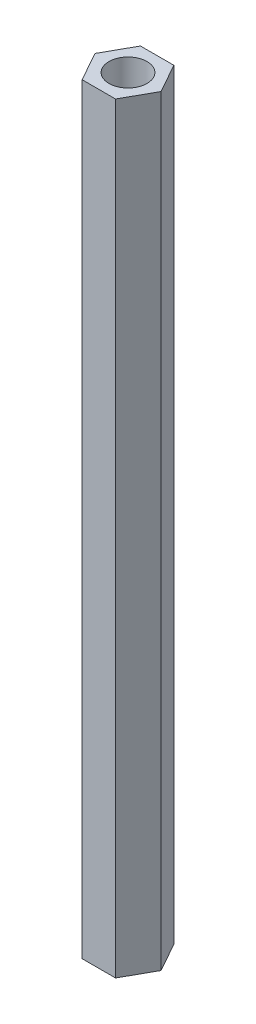
ISO-10303-21;
HEADER;
FILE_DESCRIPTION(('STEP AP214'),'2;1');
FILE_NAME('part.step','',(''),(''),'','','');
FILE_SCHEMA(('AUTOMOTIVE_DESIGN { 1 0 10303 214 1 1 1 1 }'));
ENDSEC;
DATA;
#1=APPLICATION_CONTEXT('core data for automotive mechanical design processes');
#2=APPLICATION_PROTOCOL_DEFINITION('international standard','automotive_design',2000,#1);
#3=PRODUCT_CONTEXT('',#1,'mechanical');
#4=PRODUCT('Part','Part','',(#3));
#5=PRODUCT_RELATED_PRODUCT_CATEGORY('part','',(#4));
#6=PRODUCT_DEFINITION_FORMATION('','',#4);
#7=PRODUCT_DEFINITION_CONTEXT('part definition',#1,'design');
#8=PRODUCT_DEFINITION('design','',#6,#7);
#9=PRODUCT_DEFINITION_SHAPE('','',#8);
#10=(LENGTH_UNIT() NAMED_UNIT(*) SI_UNIT(.MILLI.,.METRE.));
#11=(NAMED_UNIT(*) PLANE_ANGLE_UNIT() SI_UNIT($,.RADIAN.));
#12=(NAMED_UNIT(*) SI_UNIT($,.STERADIAN.) SOLID_ANGLE_UNIT());
#13=UNCERTAINTY_MEASURE_WITH_UNIT(LENGTH_MEASURE(1.E-05),#10,'distance_accuracy_value','');
#14=(GEOMETRIC_REPRESENTATION_CONTEXT(3) GLOBAL_UNCERTAINTY_ASSIGNED_CONTEXT((#13)) GLOBAL_UNIT_ASSIGNED_CONTEXT((#10,
#11,#12)) REPRESENTATION_CONTEXT('',''));
#15=CARTESIAN_POINT('',(0.,0.,0.));
#16=DIRECTION('',(0.,0.,1.));
#17=DIRECTION('',(1.,0.,0.));
#18=AXIS2_PLACEMENT_3D('',#15,#16,#17);
#19=CARTESIAN_POINT('',(0.,60.,0.));
#20=DIRECTION('',(0.,1.,0.));
#21=DIRECTION('',(0.,0.,1.));
#22=AXIS2_PLACEMENT_3D('',#19,#20,#21);
#23=PLANE('',#22);
#24=DIRECTION('',(1.,0.,0.));
#25=VECTOR('',#24,1.);
#26=CARTESIAN_POINT('',(-1.31685749802164,60.,2.3));
#27=LINE('',#26,#25);
#28=CARTESIAN_POINT('',(-1.31685749802164,60.,2.3));
#29=VERTEX_POINT('',#28);
#30=CARTESIAN_POINT('',(1.31685749802164,60.,2.3));
#31=VERTEX_POINT('',#30);
#32=EDGE_CURVE('E152',#29,#31,#27,.T.);
#33=ORIENTED_EDGE('',*,*,#32,.T.);
#34=DIRECTION('',(0.48719869230576,0.,-0.873291150885864));
#35=VECTOR('',#34,1.);
#36=CARTESIAN_POINT('',(1.31685749802164,60.,2.3));
#37=LINE('',#36,#35);
#38=CARTESIAN_POINT('',(2.6,60.,0.));
#39=VERTEX_POINT('',#38);
#40=EDGE_CURVE('E100',#31,#39,#37,.T.);
#41=ORIENTED_EDGE('',*,*,#40,.T.);
#42=DIRECTION('',(-0.48719869230576,0.,-0.873291150885864));
#43=VECTOR('',#42,1.);
#44=CARTESIAN_POINT('',(2.6,60.,0.));
#45=LINE('',#44,#43);
#46=CARTESIAN_POINT('',(1.31685749802164,60.,-2.3));
#47=VERTEX_POINT('',#46);
#48=EDGE_CURVE('E113',#39,#47,#45,.T.);
#49=ORIENTED_EDGE('',*,*,#48,.T.);
#50=DIRECTION('',(-1.,0.,0.));
#51=VECTOR('',#50,1.);
#52=CARTESIAN_POINT('',(1.31685749802164,60.,-2.3));
#53=LINE('',#52,#51);
#54=CARTESIAN_POINT('',(-1.31685749802164,60.,-2.3));
#55=VERTEX_POINT('',#54);
#56=EDGE_CURVE('E107',#47,#55,#53,.T.);
#57=ORIENTED_EDGE('',*,*,#56,.T.);
#58=DIRECTION('',(-0.48719869230576,0.,0.873291150885865));
#59=VECTOR('',#58,1.);
#60=CARTESIAN_POINT('',(-1.31685749802164,60.,-2.3));
#61=LINE('',#60,#59);
#62=CARTESIAN_POINT('',(-2.6,60.,0.));
#63=VERTEX_POINT('',#62);
#64=EDGE_CURVE('E111',#55,#63,#61,.T.);
#65=ORIENTED_EDGE('',*,*,#64,.T.);
#66=DIRECTION('',(0.48719869230576,0.,0.873291150885864));
#67=VECTOR('',#66,1.);
#68=CARTESIAN_POINT('',(-2.6,60.,0.));
#69=LINE('',#68,#67);
#70=EDGE_CURVE('E63',#63,#29,#69,.T.);
#71=ORIENTED_EDGE('',*,*,#70,.T.);
#72=EDGE_LOOP('',(#33,#41,#49,#57,#65,#71));
#73=FACE_BOUND('',#72,.T.);
#74=CARTESIAN_POINT('',(0.,60.,0.));
#75=DIRECTION('',(0.,1.,0.));
#76=DIRECTION('',(0.,0.,1.));
#77=AXIS2_PLACEMENT_3D('',#74,#75,#76);
#78=CIRCLE('',#77,1.5);
#79=CARTESIAN_POINT('',(0.,60.,1.5));
#80=VERTEX_POINT('',#79);
#81=EDGE_CURVE('E140',#80,#80,#78,.T.);
#82=ORIENTED_EDGE('',*,*,#81,.F.);
#83=EDGE_LOOP('',(#82));
#84=FACE_BOUND('',#83,.T.);
#85=ADVANCED_FACE('F45',(#73,#84),#23,.T.);
#86=CARTESIAN_POINT('',(0.,0.,0.));
#87=DIRECTION('',(0.,1.,0.));
#88=DIRECTION('',(0.,0.,1.));
#89=AXIS2_PLACEMENT_3D('',#86,#87,#88);
#90=PLANE('',#89);
#91=DIRECTION('',(1.,0.,0.));
#92=VECTOR('',#91,1.);
#93=CARTESIAN_POINT('',(-1.31685749802164,0.,2.3));
#94=LINE('',#93,#92);
#95=CARTESIAN_POINT('',(-1.31685749802164,0.,2.3));
#96=VERTEX_POINT('',#95);
#97=CARTESIAN_POINT('',(1.31685749802164,0.,2.3));
#98=VERTEX_POINT('',#97);
#99=EDGE_CURVE('E135',#96,#98,#94,.T.);
#100=ORIENTED_EDGE('',*,*,#99,.F.);
#101=DIRECTION('',(0.48719869230576,0.,0.873291150885864));
#102=VECTOR('',#101,1.);
#103=CARTESIAN_POINT('',(-2.6,0.,0.));
#104=LINE('',#103,#102);
#105=CARTESIAN_POINT('',(-2.6,0.,0.));
#106=VERTEX_POINT('',#105);
#107=EDGE_CURVE('E92',#106,#96,#104,.T.);
#108=ORIENTED_EDGE('',*,*,#107,.F.);
#109=DIRECTION('',(-0.48719869230576,0.,0.873291150885865));
#110=VECTOR('',#109,1.);
#111=CARTESIAN_POINT('',(-1.31685749802164,0.,-2.3));
#112=LINE('',#111,#110);
#113=CARTESIAN_POINT('',(-1.31685749802164,0.,-2.3));
#114=VERTEX_POINT('',#113);
#115=EDGE_CURVE('E86',#114,#106,#112,.T.);
#116=ORIENTED_EDGE('',*,*,#115,.F.);
#117=DIRECTION('',(-1.,0.,0.));
#118=VECTOR('',#117,1.);
#119=CARTESIAN_POINT('',(1.31685749802164,0.,-2.3));
#120=LINE('',#119,#118);
#121=CARTESIAN_POINT('',(1.31685749802164,0.,-2.3));
#122=VERTEX_POINT('',#121);
#123=EDGE_CURVE('E122',#122,#114,#120,.T.);
#124=ORIENTED_EDGE('',*,*,#123,.F.);
#125=DIRECTION('',(-0.48719869230576,0.,-0.873291150885864));
#126=VECTOR('',#125,1.);
#127=CARTESIAN_POINT('',(2.6,0.,0.));
#128=LINE('',#127,#126);
#129=CARTESIAN_POINT('',(2.6,0.,0.));
#130=VERTEX_POINT('',#129);
#131=EDGE_CURVE('E143',#130,#122,#128,.T.);
#132=ORIENTED_EDGE('',*,*,#131,.F.);
#133=DIRECTION('',(0.48719869230576,0.,-0.873291150885864));
#134=VECTOR('',#133,1.);
#135=CARTESIAN_POINT('',(1.31685749802164,0.,2.3));
#136=LINE('',#135,#134);
#137=EDGE_CURVE('E139',#98,#130,#136,.T.);
#138=ORIENTED_EDGE('',*,*,#137,.F.);
#139=EDGE_LOOP('',(#100,#108,#116,#124,#132,#138));
#140=FACE_BOUND('',#139,.T.);
#141=CARTESIAN_POINT('',(0.,0.,0.));
#142=DIRECTION('',(0.,1.,0.));
#143=DIRECTION('',(0.,0.,1.));
#144=AXIS2_PLACEMENT_3D('',#141,#142,#143);
#145=CIRCLE('',#144,1.5);
#146=CARTESIAN_POINT('',(0.,0.,1.5));
#147=VERTEX_POINT('',#146);
#148=EDGE_CURVE('E249',#147,#147,#145,.T.);
#149=ORIENTED_EDGE('',*,*,#148,.T.);
#150=EDGE_LOOP('',(#149));
#151=FACE_BOUND('',#150,.T.);
#152=ADVANCED_FACE('F165',(#140,#151),#90,.F.);
#153=CARTESIAN_POINT('',(-1.31685749802164,60.,2.3));
#154=DIRECTION('',(0.,0.,-1.));
#155=DIRECTION('',(-1.,0.,0.));
#156=AXIS2_PLACEMENT_3D('',#153,#154,#155);
#157=PLANE('',#156);
#158=ORIENTED_EDGE('',*,*,#99,.T.);
#159=DIRECTION('',(0.,-1.,0.));
#160=VECTOR('',#159,1.);
#161=CARTESIAN_POINT('',(1.31685749802164,60.,2.3));
#162=LINE('',#161,#160);
#163=EDGE_CURVE('E11',#31,#98,#162,.T.);
#164=ORIENTED_EDGE('',*,*,#163,.F.);
#165=ORIENTED_EDGE('',*,*,#32,.F.);
#166=DIRECTION('',(0.,-1.,0.));
#167=VECTOR('',#166,1.);
#168=CARTESIAN_POINT('',(-1.31685749802164,60.,2.3));
#169=LINE('',#168,#167);
#170=EDGE_CURVE('E131',#29,#96,#169,.T.);
#171=ORIENTED_EDGE('',*,*,#170,.T.);
#172=EDGE_LOOP('',(#158,#164,#165,#171));
#173=FACE_BOUND('',#172,.T.);
#174=ADVANCED_FACE('F47',(#173),#157,.F.);
#175=CARTESIAN_POINT('',(1.31685749802164,60.,2.3));
#176=DIRECTION('',(-0.873291150885864,0.,-0.48719869230576));
#177=DIRECTION('',(-0.48719869230576,0.,0.873291150885864));
#178=AXIS2_PLACEMENT_3D('',#175,#176,#177);
#179=PLANE('',#178);
#180=ORIENTED_EDGE('',*,*,#137,.T.);
#181=DIRECTION('',(0.,-1.,0.));
#182=VECTOR('',#181,1.);
#183=CARTESIAN_POINT('',(2.6,60.,0.));
#184=LINE('',#183,#182);
#185=EDGE_CURVE('E55',#39,#130,#184,.T.);
#186=ORIENTED_EDGE('',*,*,#185,.F.);
#187=ORIENTED_EDGE('',*,*,#40,.F.);
#188=ORIENTED_EDGE('',*,*,#163,.T.);
#189=EDGE_LOOP('',(#180,#186,#187,#188));
#190=FACE_BOUND('',#189,.T.);
#191=ADVANCED_FACE('F190',(#190),#179,.F.);
#192=CARTESIAN_POINT('',(2.6,60.,0.));
#193=DIRECTION('',(-0.873291150885864,0.,0.48719869230576));
#194=DIRECTION('',(0.48719869230576,0.,0.873291150885864));
#195=AXIS2_PLACEMENT_3D('',#192,#193,#194);
#196=PLANE('',#195);
#197=ORIENTED_EDGE('',*,*,#131,.T.);
#198=DIRECTION('',(0.,-1.,0.));
#199=VECTOR('',#198,1.);
#200=CARTESIAN_POINT('',(1.31685749802164,60.,-2.3));
#201=LINE('',#200,#199);
#202=EDGE_CURVE('E124',#47,#122,#201,.T.);
#203=ORIENTED_EDGE('',*,*,#202,.F.);
#204=ORIENTED_EDGE('',*,*,#48,.F.);
#205=ORIENTED_EDGE('',*,*,#185,.T.);
#206=EDGE_LOOP('',(#197,#203,#204,#205));
#207=FACE_BOUND('',#206,.T.);
#208=ADVANCED_FACE('F162',(#207),#196,.F.);
#209=CARTESIAN_POINT('',(1.31685749802164,60.,-2.3));
#210=DIRECTION('',(0.,0.,1.));
#211=DIRECTION('',(1.,0.,0.));
#212=AXIS2_PLACEMENT_3D('',#209,#210,#211);
#213=PLANE('',#212);
#214=ORIENTED_EDGE('',*,*,#123,.T.);
#215=DIRECTION('',(0.,-1.,0.));
#216=VECTOR('',#215,1.);
#217=CARTESIAN_POINT('',(-1.31685749802164,60.,-2.3));
#218=LINE('',#217,#216);
#219=EDGE_CURVE('E119',#55,#114,#218,.T.);
#220=ORIENTED_EDGE('',*,*,#219,.F.);
#221=ORIENTED_EDGE('',*,*,#56,.F.);
#222=ORIENTED_EDGE('',*,*,#202,.T.);
#223=EDGE_LOOP('',(#214,#220,#221,#222));
#224=FACE_BOUND('',#223,.T.);
#225=ADVANCED_FACE('F120',(#224),#213,.F.);
#226=CARTESIAN_POINT('',(-1.31685749802164,60.,-2.3));
#227=DIRECTION('',(0.873291150885865,0.,0.48719869230576));
#228=DIRECTION('',(0.48719869230576,0.,-0.873291150885865));
#229=AXIS2_PLACEMENT_3D('',#226,#227,#228);
#230=PLANE('',#229);
#231=ORIENTED_EDGE('',*,*,#115,.T.);
#232=DIRECTION('',(0.,-1.,0.));
#233=VECTOR('',#232,1.);
#234=CARTESIAN_POINT('',(-2.6,60.,0.));
#235=LINE('',#234,#233);
#236=EDGE_CURVE('E125',#63,#106,#235,.T.);
#237=ORIENTED_EDGE('',*,*,#236,.F.);
#238=ORIENTED_EDGE('',*,*,#64,.F.);
#239=ORIENTED_EDGE('',*,*,#219,.T.);
#240=EDGE_LOOP('',(#231,#237,#238,#239));
#241=FACE_BOUND('',#240,.T.);
#242=ADVANCED_FACE('F127',(#241),#230,.F.);
#243=CARTESIAN_POINT('',(-2.6,60.,0.));
#244=DIRECTION('',(0.873291150885864,0.,-0.48719869230576));
#245=DIRECTION('',(-0.48719869230576,0.,-0.873291150885864));
#246=AXIS2_PLACEMENT_3D('',#243,#244,#245);
#247=PLANE('',#246);
#248=ORIENTED_EDGE('',*,*,#107,.T.);
#249=ORIENTED_EDGE('',*,*,#170,.F.);
#250=ORIENTED_EDGE('',*,*,#70,.F.);
#251=ORIENTED_EDGE('',*,*,#236,.T.);
#252=EDGE_LOOP('',(#248,#249,#250,#251));
#253=FACE_BOUND('',#252,.T.);
#254=ADVANCED_FACE('F170',(#253),#247,.F.);
#255=CARTESIAN_POINT('',(0.,60.,0.));
#256=DIRECTION('',(0.,-1.,0.));
#257=DIRECTION('',(0.,0.,-1.));
#258=AXIS2_PLACEMENT_3D('',#255,#256,#257);
#259=CYLINDRICAL_SURFACE('',#258,1.5);
#260=ORIENTED_EDGE('',*,*,#81,.T.);
#261=EDGE_LOOP('',(#260));
#262=FACE_BOUND('',#261,.T.);
#263=ORIENTED_EDGE('',*,*,#148,.F.);
#264=EDGE_LOOP('',(#263));
#265=FACE_BOUND('',#264,.T.);
#266=ADVANCED_FACE('F172',(#262,#265),#259,.F.);
#267=CLOSED_SHELL('',(#85,#152,#174,#191,#208,#225,#242,#254,#266));
#268=MANIFOLD_SOLID_BREP('B2',#267);
#269=ADVANCED_BREP_SHAPE_REPRESENTATION('',(#18,#268),#14);
#270=SHAPE_DEFINITION_REPRESENTATION(#9,#269);
ENDSEC;
END-ISO-10303-21;
